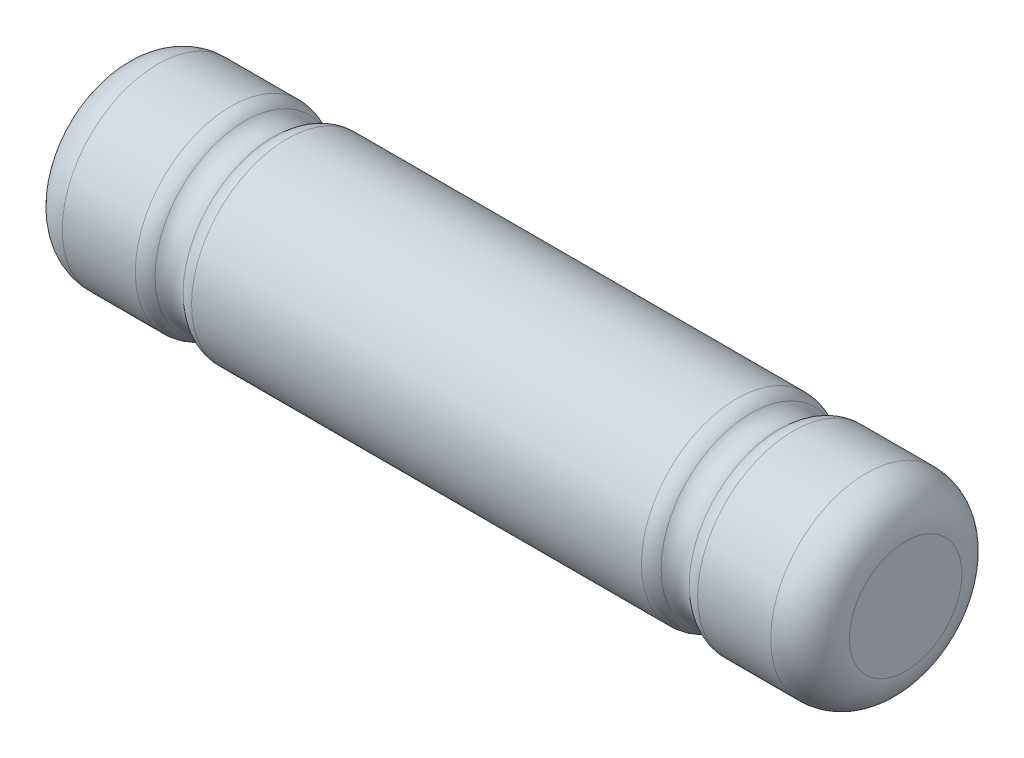
ISO-10303-21;
HEADER;
FILE_DESCRIPTION(('STEP AP214'),'2;1');
FILE_NAME('part.step','',(''),(''),'','','');
FILE_SCHEMA(('AUTOMOTIVE_DESIGN { 1 0 10303 214 1 1 1 1 }'));
ENDSEC;
DATA;
#1=APPLICATION_CONTEXT('core data for automotive mechanical design processes');
#2=APPLICATION_PROTOCOL_DEFINITION('international standard','automotive_design',2000,#1);
#3=PRODUCT_CONTEXT('',#1,'mechanical');
#4=PRODUCT('Part','Part','',(#3));
#5=PRODUCT_RELATED_PRODUCT_CATEGORY('part','',(#4));
#6=PRODUCT_DEFINITION_FORMATION('','',#4);
#7=PRODUCT_DEFINITION_CONTEXT('part definition',#1,'design');
#8=PRODUCT_DEFINITION('design','',#6,#7);
#9=PRODUCT_DEFINITION_SHAPE('','',#8);
#10=(LENGTH_UNIT() NAMED_UNIT(*) SI_UNIT(.MILLI.,.METRE.));
#11=(NAMED_UNIT(*) PLANE_ANGLE_UNIT() SI_UNIT($,.RADIAN.));
#12=(NAMED_UNIT(*) SI_UNIT($,.STERADIAN.) SOLID_ANGLE_UNIT());
#13=UNCERTAINTY_MEASURE_WITH_UNIT(LENGTH_MEASURE(1.E-05),#10,'distance_accuracy_value','');
#14=(GEOMETRIC_REPRESENTATION_CONTEXT(3) GLOBAL_UNCERTAINTY_ASSIGNED_CONTEXT((#13)) GLOBAL_UNIT_ASSIGNED_CONTEXT((#10,
#11,#12)) REPRESENTATION_CONTEXT('',''));
#15=CARTESIAN_POINT('',(0.,0.,0.));
#16=DIRECTION('',(0.,0.,1.));
#17=DIRECTION('',(1.,0.,0.));
#18=AXIS2_PLACEMENT_3D('',#15,#16,#17);
#19=CARTESIAN_POINT('',(-7.,0.,0.));
#20=DIRECTION('',(1.,0.,0.));
#21=DIRECTION('',(0.,0.,-1.));
#22=AXIS2_PLACEMENT_3D('',#19,#20,#21);
#23=PLANE('',#22);
#24=CARTESIAN_POINT('',(-7.,0.,0.));
#25=DIRECTION('',(-1.,0.,0.));
#26=DIRECTION('',(0.,0.,1.));
#27=AXIS2_PLACEMENT_3D('',#24,#25,#26);
#28=CIRCLE('',#27,1.);
#29=CARTESIAN_POINT('',(-7.,0.,1.));
#30=VERTEX_POINT('',#29);
#31=EDGE_CURVE('E10',#30,#30,#28,.T.);
#32=ORIENTED_EDGE('',*,*,#31,.T.);
#33=EDGE_LOOP('',(#32));
#34=FACE_BOUND('',#33,.T.);
#35=ADVANCED_FACE('F31',(#34),#23,.F.);
#36=CARTESIAN_POINT('',(-6.3,0.,0.));
#37=DIRECTION('',(-1.,0.,0.));
#38=DIRECTION('',(0.,0.,1.));
#39=AXIS2_PLACEMENT_3D('',#36,#37,#38);
#40=TOROIDAL_SURFACE('',#39,1.,0.7);
#41=ORIENTED_EDGE('',*,*,#31,.F.);
#42=EDGE_LOOP('',(#41));
#43=FACE_BOUND('',#42,.T.);
#44=CARTESIAN_POINT('',(-6.3,0.,0.));
#45=DIRECTION('',(-1.,0.,0.));
#46=DIRECTION('',(0.,0.,1.));
#47=AXIS2_PLACEMENT_3D('',#44,#45,#46);
#48=CIRCLE('',#47,1.7);
#49=CARTESIAN_POINT('',(-6.3,0.,1.7));
#50=VERTEX_POINT('',#49);
#51=EDGE_CURVE('E37',#50,#50,#48,.T.);
#52=ORIENTED_EDGE('',*,*,#51,.T.);
#53=EDGE_LOOP('',(#52));
#54=FACE_BOUND('',#53,.T.);
#55=ADVANCED_FACE('F87',(#43,#54),#40,.T.);
#56=CARTESIAN_POINT('',(-7.,0.,0.));
#57=DIRECTION('',(-1.,0.,0.));
#58=DIRECTION('',(0.,0.,1.));
#59=AXIS2_PLACEMENT_3D('',#56,#57,#58);
#60=CYLINDRICAL_SURFACE('',#59,1.7);
#61=ORIENTED_EDGE('',*,*,#51,.F.);
#62=EDGE_LOOP('',(#61));
#63=FACE_BOUND('',#62,.T.);
#64=CARTESIAN_POINT('',(-5.,0.,0.));
#65=DIRECTION('',(-1.,0.,0.));
#66=DIRECTION('',(0.,0.,1.));
#67=AXIS2_PLACEMENT_3D('',#64,#65,#66);
#68=CIRCLE('',#67,1.7);
#69=CARTESIAN_POINT('',(-5.,0.,1.7));
#70=VERTEX_POINT('',#69);
#71=EDGE_CURVE('E41',#70,#70,#68,.T.);
#72=ORIENTED_EDGE('',*,*,#71,.T.);
#73=EDGE_LOOP('',(#72));
#74=FACE_BOUND('',#73,.T.);
#75=ADVANCED_FACE('F91',(#63,#74),#60,.T.);
#76=CARTESIAN_POINT('',(-5.,0.,0.));
#77=DIRECTION('',(-1.,0.,0.));
#78=DIRECTION('',(0.,0.,1.));
#79=AXIS2_PLACEMENT_3D('',#76,#77,#78);
#80=TOROIDAL_SURFACE('',#79,1.3375,0.362499999999997);
#81=ORIENTED_EDGE('',*,*,#71,.F.);
#82=EDGE_LOOP('',(#81));
#83=FACE_BOUND('',#82,.T.);
#84=CARTESIAN_POINT('',(-4.75,0.,0.));
#85=DIRECTION('',(-1.,0.,0.));
#86=DIRECTION('',(0.,0.,1.));
#87=AXIS2_PLACEMENT_3D('',#84,#85,#86);
#88=CIRCLE('',#87,1.6);
#89=CARTESIAN_POINT('',(-4.75,0.,1.6));
#90=VERTEX_POINT('',#89);
#91=EDGE_CURVE('E45',#90,#90,#88,.T.);
#92=ORIENTED_EDGE('',*,*,#91,.T.);
#93=EDGE_LOOP('',(#92));
#94=FACE_BOUND('',#93,.T.);
#95=ADVANCED_FACE('F96',(#83,#94),#80,.T.);
#96=CARTESIAN_POINT('',(-4.5,0.,0.));
#97=DIRECTION('',(-1.,0.,0.));
#98=DIRECTION('',(0.,0.,1.));
#99=AXIS2_PLACEMENT_3D('',#96,#97,#98);
#100=TOROIDAL_SURFACE('',#99,1.8625,0.362499999999998);
#101=ORIENTED_EDGE('',*,*,#91,.F.);
#102=EDGE_LOOP('',(#101));
#103=FACE_BOUND('',#102,.T.);
#104=CARTESIAN_POINT('',(-4.25,0.,0.));
#105=DIRECTION('',(-1.,0.,0.));
#106=DIRECTION('',(0.,0.,1.));
#107=AXIS2_PLACEMENT_3D('',#104,#105,#106);
#108=CIRCLE('',#107,1.6);
#109=CARTESIAN_POINT('',(-4.25,0.,1.6));
#110=VERTEX_POINT('',#109);
#111=EDGE_CURVE('E50',#110,#110,#108,.T.);
#112=ORIENTED_EDGE('',*,*,#111,.T.);
#113=EDGE_LOOP('',(#112));
#114=FACE_BOUND('',#113,.T.);
#115=ADVANCED_FACE('F102',(#103,#114),#100,.F.);
#116=CARTESIAN_POINT('',(-4.,0.,0.));
#117=DIRECTION('',(-1.,0.,0.));
#118=DIRECTION('',(0.,0.,1.));
#119=AXIS2_PLACEMENT_3D('',#116,#117,#118);
#120=TOROIDAL_SURFACE('',#119,1.3375,0.362499999999997);
#121=ORIENTED_EDGE('',*,*,#111,.F.);
#122=EDGE_LOOP('',(#121));
#123=FACE_BOUND('',#122,.T.);
#124=CARTESIAN_POINT('',(-4.,0.,0.));
#125=DIRECTION('',(-1.,0.,0.));
#126=DIRECTION('',(0.,0.,1.));
#127=AXIS2_PLACEMENT_3D('',#124,#125,#126);
#128=CIRCLE('',#127,1.7);
#129=CARTESIAN_POINT('',(-4.,0.,1.7));
#130=VERTEX_POINT('',#129);
#131=EDGE_CURVE('E53',#130,#130,#128,.T.);
#132=ORIENTED_EDGE('',*,*,#131,.T.);
#133=EDGE_LOOP('',(#132));
#134=FACE_BOUND('',#133,.T.);
#135=ADVANCED_FACE('F106',(#123,#134),#120,.T.);
#136=CARTESIAN_POINT('',(-7.,0.,0.));
#137=DIRECTION('',(-1.,0.,0.));
#138=DIRECTION('',(0.,0.,1.));
#139=AXIS2_PLACEMENT_3D('',#136,#137,#138);
#140=CYLINDRICAL_SURFACE('',#139,1.7);
#141=ORIENTED_EDGE('',*,*,#131,.F.);
#142=EDGE_LOOP('',(#141));
#143=FACE_BOUND('',#142,.T.);
#144=CARTESIAN_POINT('',(4.,0.,0.));
#145=DIRECTION('',(-1.,0.,0.));
#146=DIRECTION('',(0.,0.,1.));
#147=AXIS2_PLACEMENT_3D('',#144,#145,#146);
#148=CIRCLE('',#147,1.7);
#149=CARTESIAN_POINT('',(4.,0.,1.7));
#150=VERTEX_POINT('',#149);
#151=EDGE_CURVE('E56',#150,#150,#148,.T.);
#152=ORIENTED_EDGE('',*,*,#151,.T.);
#153=EDGE_LOOP('',(#152));
#154=FACE_BOUND('',#153,.T.);
#155=ADVANCED_FACE('F110',(#143,#154),#140,.T.);
#156=CARTESIAN_POINT('',(4.,0.,0.));
#157=DIRECTION('',(-1.,0.,0.));
#158=DIRECTION('',(0.,0.,1.));
#159=AXIS2_PLACEMENT_3D('',#156,#157,#158);
#160=TOROIDAL_SURFACE('',#159,1.3375,0.362499999999997);
#161=ORIENTED_EDGE('',*,*,#151,.F.);
#162=EDGE_LOOP('',(#161));
#163=FACE_BOUND('',#162,.T.);
#164=CARTESIAN_POINT('',(4.25,0.,0.));
#165=DIRECTION('',(-1.,0.,0.));
#166=DIRECTION('',(0.,0.,1.));
#167=AXIS2_PLACEMENT_3D('',#164,#165,#166);
#168=CIRCLE('',#167,1.6);
#169=CARTESIAN_POINT('',(4.25,0.,1.6));
#170=VERTEX_POINT('',#169);
#171=EDGE_CURVE('E59',#170,#170,#168,.T.);
#172=ORIENTED_EDGE('',*,*,#171,.T.);
#173=EDGE_LOOP('',(#172));
#174=FACE_BOUND('',#173,.T.);
#175=ADVANCED_FACE('F114',(#163,#174),#160,.T.);
#176=CARTESIAN_POINT('',(4.5,0.,0.));
#177=DIRECTION('',(-1.,0.,0.));
#178=DIRECTION('',(0.,0.,1.));
#179=AXIS2_PLACEMENT_3D('',#176,#177,#178);
#180=TOROIDAL_SURFACE('',#179,1.8625,0.362499999999998);
#181=ORIENTED_EDGE('',*,*,#171,.F.);
#182=EDGE_LOOP('',(#181));
#183=FACE_BOUND('',#182,.T.);
#184=CARTESIAN_POINT('',(4.75,0.,0.));
#185=DIRECTION('',(-1.,0.,0.));
#186=DIRECTION('',(0.,0.,1.));
#187=AXIS2_PLACEMENT_3D('',#184,#185,#186);
#188=CIRCLE('',#187,1.6);
#189=CARTESIAN_POINT('',(4.75,0.,1.6));
#190=VERTEX_POINT('',#189);
#191=EDGE_CURVE('E62',#190,#190,#188,.T.);
#192=ORIENTED_EDGE('',*,*,#191,.T.);
#193=EDGE_LOOP('',(#192));
#194=FACE_BOUND('',#193,.T.);
#195=ADVANCED_FACE('F118',(#183,#194),#180,.F.);
#196=CARTESIAN_POINT('',(5.,0.,0.));
#197=DIRECTION('',(-1.,0.,0.));
#198=DIRECTION('',(0.,0.,1.));
#199=AXIS2_PLACEMENT_3D('',#196,#197,#198);
#200=TOROIDAL_SURFACE('',#199,1.3375,0.362499999999997);
#201=ORIENTED_EDGE('',*,*,#191,.F.);
#202=EDGE_LOOP('',(#201));
#203=FACE_BOUND('',#202,.T.);
#204=CARTESIAN_POINT('',(5.,0.,0.));
#205=DIRECTION('',(-1.,0.,0.));
#206=DIRECTION('',(0.,0.,1.));
#207=AXIS2_PLACEMENT_3D('',#204,#205,#206);
#208=CIRCLE('',#207,1.7);
#209=CARTESIAN_POINT('',(5.,0.,1.7));
#210=VERTEX_POINT('',#209);
#211=EDGE_CURVE('E65',#210,#210,#208,.T.);
#212=ORIENTED_EDGE('',*,*,#211,.T.);
#213=EDGE_LOOP('',(#212));
#214=FACE_BOUND('',#213,.T.);
#215=ADVANCED_FACE('F122',(#203,#214),#200,.T.);
#216=CARTESIAN_POINT('',(-7.,0.,0.));
#217=DIRECTION('',(-1.,0.,0.));
#218=DIRECTION('',(0.,0.,1.));
#219=AXIS2_PLACEMENT_3D('',#216,#217,#218);
#220=CYLINDRICAL_SURFACE('',#219,1.7);
#221=ORIENTED_EDGE('',*,*,#211,.F.);
#222=EDGE_LOOP('',(#221));
#223=FACE_BOUND('',#222,.T.);
#224=CARTESIAN_POINT('',(6.3,0.,0.));
#225=DIRECTION('',(-1.,0.,0.));
#226=DIRECTION('',(0.,0.,1.));
#227=AXIS2_PLACEMENT_3D('',#224,#225,#226);
#228=CIRCLE('',#227,1.7);
#229=CARTESIAN_POINT('',(6.3,0.,1.7));
#230=VERTEX_POINT('',#229);
#231=EDGE_CURVE('E68',#230,#230,#228,.T.);
#232=ORIENTED_EDGE('',*,*,#231,.T.);
#233=EDGE_LOOP('',(#232));
#234=FACE_BOUND('',#233,.T.);
#235=ADVANCED_FACE('F83',(#223,#234),#220,.T.);
#236=CARTESIAN_POINT('',(6.3,0.,0.));
#237=DIRECTION('',(-1.,0.,0.));
#238=DIRECTION('',(0.,0.,1.));
#239=AXIS2_PLACEMENT_3D('',#236,#237,#238);
#240=TOROIDAL_SURFACE('',#239,1.,0.7);
#241=ORIENTED_EDGE('',*,*,#231,.F.);
#242=EDGE_LOOP('',(#241));
#243=FACE_BOUND('',#242,.T.);
#244=CARTESIAN_POINT('',(7.,0.,0.));
#245=DIRECTION('',(-1.,0.,0.));
#246=DIRECTION('',(0.,0.,1.));
#247=AXIS2_PLACEMENT_3D('',#244,#245,#246);
#248=CIRCLE('',#247,1.);
#249=CARTESIAN_POINT('',(7.,0.,1.));
#250=VERTEX_POINT('',#249);
#251=EDGE_CURVE('E71',#250,#250,#248,.T.);
#252=ORIENTED_EDGE('',*,*,#251,.T.);
#253=EDGE_LOOP('',(#252));
#254=FACE_BOUND('',#253,.T.);
#255=ADVANCED_FACE('F75',(#243,#254),#240,.T.);
#256=CARTESIAN_POINT('',(7.,0.,0.));
#257=DIRECTION('',(-1.,0.,0.));
#258=DIRECTION('',(0.,0.,1.));
#259=AXIS2_PLACEMENT_3D('',#256,#257,#258);
#260=PLANE('',#259);
#261=ORIENTED_EDGE('',*,*,#251,.F.);
#262=EDGE_LOOP('',(#261));
#263=FACE_BOUND('',#262,.T.);
#264=ADVANCED_FACE('F77',(#263),#260,.F.);
#265=CLOSED_SHELL('',(#35,#55,#75,#95,#115,#135,#155,#175,#195,#215,#235,#255,#264));
#266=MANIFOLD_SOLID_BREP('B2',#265);
#267=ADVANCED_BREP_SHAPE_REPRESENTATION('',(#18,#266),#14);
#268=SHAPE_DEFINITION_REPRESENTATION(#9,#267);
ENDSEC;
END-ISO-10303-21;
